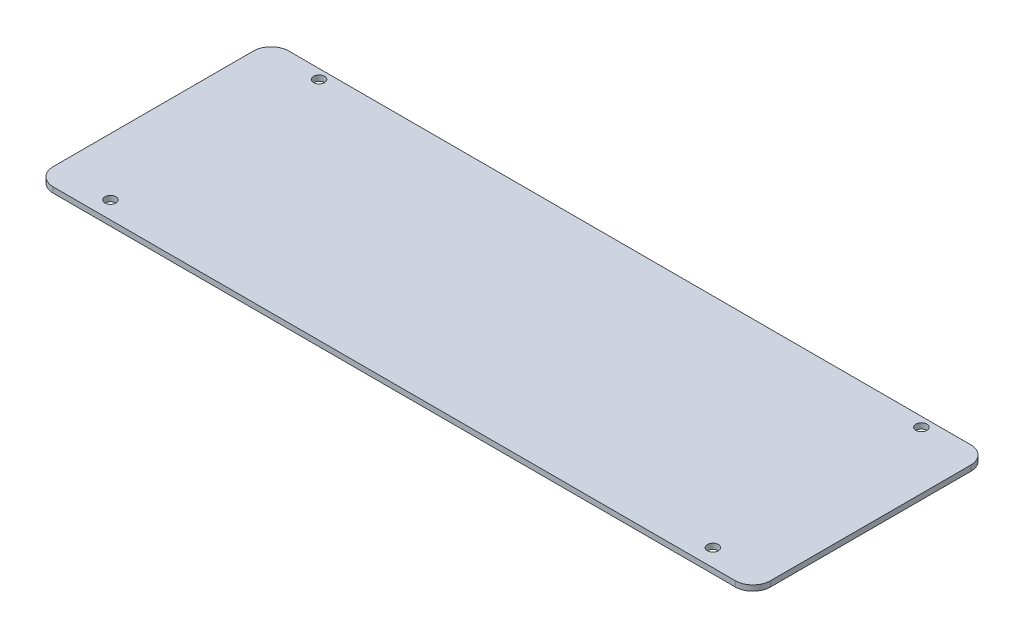
ISO-10303-21;
HEADER;
FILE_DESCRIPTION(('STEP AP214'),'2;1');
FILE_NAME('part.step','',(''),(''),'','','');
FILE_SCHEMA(('AUTOMOTIVE_DESIGN { 1 0 10303 214 1 1 1 1 }'));
ENDSEC;
DATA;
#1=APPLICATION_CONTEXT('core data for automotive mechanical design processes');
#2=APPLICATION_PROTOCOL_DEFINITION('international standard','automotive_design',2000,#1);
#3=PRODUCT_CONTEXT('',#1,'mechanical');
#4=PRODUCT('Part','Part','',(#3));
#5=PRODUCT_RELATED_PRODUCT_CATEGORY('part','',(#4));
#6=PRODUCT_DEFINITION_FORMATION('','',#4);
#7=PRODUCT_DEFINITION_CONTEXT('part definition',#1,'design');
#8=PRODUCT_DEFINITION('design','',#6,#7);
#9=PRODUCT_DEFINITION_SHAPE('','',#8);
#10=(LENGTH_UNIT() NAMED_UNIT(*) SI_UNIT(.MILLI.,.METRE.));
#11=(NAMED_UNIT(*) PLANE_ANGLE_UNIT() SI_UNIT($,.RADIAN.));
#12=(NAMED_UNIT(*) SI_UNIT($,.STERADIAN.) SOLID_ANGLE_UNIT());
#13=UNCERTAINTY_MEASURE_WITH_UNIT(LENGTH_MEASURE(1.E-05),#10,'distance_accuracy_value','');
#14=(GEOMETRIC_REPRESENTATION_CONTEXT(3) GLOBAL_UNCERTAINTY_ASSIGNED_CONTEXT((#13)) GLOBAL_UNIT_ASSIGNED_CONTEXT((#10,
#11,#12)) REPRESENTATION_CONTEXT('',''));
#15=CARTESIAN_POINT('',(0.,0.,0.));
#16=DIRECTION('',(0.,0.,1.));
#17=DIRECTION('',(1.,0.,0.));
#18=AXIS2_PLACEMENT_3D('',#15,#16,#17);
#19=CARTESIAN_POINT('',(0.,3.175,0.));
#20=DIRECTION('',(0.,-1.,0.));
#21=DIRECTION('',(0.,0.,-1.));
#22=AXIS2_PLACEMENT_3D('',#19,#20,#21);
#23=PLANE('',#22);
#24=DIRECTION('',(1.,0.,0.));
#25=VECTOR('',#24,1.);
#26=CARTESIAN_POINT('',(-205.196110364079,3.175,128.502458795408));
#27=LINE('',#26,#25);
#28=CARTESIAN_POINT('',(-195.036110364079,3.175,128.502458795408));
#29=VERTEX_POINT('',#28);
#30=CARTESIAN_POINT('',(199.28788965792,3.175,128.502458795408));
#31=VERTEX_POINT('',#30);
#32=EDGE_CURVE('E174',#29,#31,#27,.T.);
#33=ORIENTED_EDGE('',*,*,#32,.T.);
#34=CARTESIAN_POINT('',(199.28788965792,3.175,118.342458795408));
#35=DIRECTION('',(0.,-1.,0.));
#36=DIRECTION('',(0.,0.,-1.));
#37=AXIS2_PLACEMENT_3D('',#34,#35,#36);
#38=CIRCLE('',#37,10.16);
#39=CARTESIAN_POINT('',(209.44788965792,3.175,118.342458795408));
#40=VERTEX_POINT('',#39);
#41=EDGE_CURVE('E151',#31,#40,#38,.F.);
#42=ORIENTED_EDGE('',*,*,#41,.T.);
#43=DIRECTION('',(0.,0.,-1.));
#44=VECTOR('',#43,1.);
#45=CARTESIAN_POINT('',(209.44788965792,3.175,128.502458795408));
#46=LINE('',#45,#44);
#47=CARTESIAN_POINT('',(209.44788965792,3.175,2.55563577288898));
#48=VERTEX_POINT('',#47);
#49=EDGE_CURVE('E121',#40,#48,#46,.T.);
#50=ORIENTED_EDGE('',*,*,#49,.T.);
#51=CARTESIAN_POINT('',(199.28788965792,3.175,2.55563577288899));
#52=DIRECTION('',(0.,-1.,0.));
#53=DIRECTION('',(0.,0.,-1.));
#54=AXIS2_PLACEMENT_3D('',#51,#52,#53);
#55=CIRCLE('',#54,10.16);
#56=CARTESIAN_POINT('',(199.28788965792,3.175,-7.60436422711101));
#57=VERTEX_POINT('',#56);
#58=EDGE_CURVE('E58',#48,#57,#55,.F.);
#59=ORIENTED_EDGE('',*,*,#58,.T.);
#60=DIRECTION('',(-1.,0.,0.));
#61=VECTOR('',#60,1.);
#62=CARTESIAN_POINT('',(-205.196110364079,3.175,-7.60436422711101));
#63=LINE('',#62,#61);
#64=CARTESIAN_POINT('',(-195.036110364079,3.175,-7.60436422711101));
#65=VERTEX_POINT('',#64);
#66=EDGE_CURVE('E137',#57,#65,#63,.T.);
#67=ORIENTED_EDGE('',*,*,#66,.T.);
#68=CARTESIAN_POINT('',(-195.036110364079,3.175,2.55563577288898));
#69=DIRECTION('',(0.,-1.,0.));
#70=DIRECTION('',(0.,0.,-1.));
#71=AXIS2_PLACEMENT_3D('',#68,#69,#70);
#72=CIRCLE('',#71,10.16);
#73=CARTESIAN_POINT('',(-205.196110364079,3.175,2.55563577288898));
#74=VERTEX_POINT('',#73);
#75=EDGE_CURVE('E146',#65,#74,#72,.F.);
#76=ORIENTED_EDGE('',*,*,#75,.T.);
#77=DIRECTION('',(0.,0.,1.));
#78=VECTOR('',#77,1.);
#79=CARTESIAN_POINT('',(-205.196110364079,3.175,128.502458795408));
#80=LINE('',#79,#78);
#81=CARTESIAN_POINT('',(-205.196110364079,3.175,118.342458795408));
#82=VERTEX_POINT('',#81);
#83=EDGE_CURVE('E131',#74,#82,#80,.T.);
#84=ORIENTED_EDGE('',*,*,#83,.T.);
#85=CARTESIAN_POINT('',(-195.036110364079,3.175,118.342458795408));
#86=DIRECTION('',(0.,-1.,0.));
#87=DIRECTION('',(0.,0.,-1.));
#88=AXIS2_PLACEMENT_3D('',#85,#86,#87);
#89=CIRCLE('',#88,10.16);
#90=EDGE_CURVE('E148',#82,#29,#89,.F.);
#91=ORIENTED_EDGE('',*,*,#90,.T.);
#92=EDGE_LOOP('',(#33,#42,#50,#59,#67,#76,#84,#91));
#93=FACE_BOUND('',#92,.T.);
#94=CARTESIAN_POINT('',(-171.991110353079,3.175,-2.12847717143634));
#95=DIRECTION('',(0.,1.,0.));
#96=DIRECTION('',(0.,0.,1.));
#97=AXIS2_PLACEMENT_3D('',#94,#95,#96);
#98=CIRCLE('',#97,3.17499999999997);
#99=CARTESIAN_POINT('',(-171.991110353079,3.175,1.04652282856363));
#100=VERTEX_POINT('',#99);
#101=EDGE_CURVE('E167',#100,#100,#98,.T.);
#102=ORIENTED_EDGE('',*,*,#101,.F.);
#103=EDGE_LOOP('',(#102));
#104=FACE_BOUND('',#103,.T.);
#105=CARTESIAN_POINT('',(-171.991110353079,3.175,118.449728987914));
#106=DIRECTION('',(0.,1.,0.));
#107=DIRECTION('',(0.,0.,1.));
#108=AXIS2_PLACEMENT_3D('',#105,#106,#107);
#109=CIRCLE('',#108,3.17499999999997);
#110=CARTESIAN_POINT('',(-171.991110353079,3.175,121.624728987914));
#111=VERTEX_POINT('',#110);
#112=EDGE_CURVE('E179',#111,#111,#109,.T.);
#113=ORIENTED_EDGE('',*,*,#112,.F.);
#114=EDGE_LOOP('',(#113));
#115=FACE_BOUND('',#114,.T.);
#116=CARTESIAN_POINT('',(176.24288964692,3.175,-2.12847717143634));
#117=DIRECTION('',(0.,1.,0.));
#118=DIRECTION('',(0.,0.,-1.));
#119=AXIS2_PLACEMENT_3D('',#116,#117,#118);
#120=CIRCLE('',#119,3.17499999999997);
#121=CARTESIAN_POINT('',(176.24288964692,3.175,-5.30347717143631));
#122=VERTEX_POINT('',#121);
#123=EDGE_CURVE('E184',#122,#122,#120,.T.);
#124=ORIENTED_EDGE('',*,*,#123,.F.);
#125=EDGE_LOOP('',(#124));
#126=FACE_BOUND('',#125,.T.);
#127=CARTESIAN_POINT('',(176.24288964692,3.175,118.449728987914));
#128=DIRECTION('',(0.,1.,0.));
#129=DIRECTION('',(0.,0.,-1.));
#130=AXIS2_PLACEMENT_3D('',#127,#128,#129);
#131=CIRCLE('',#130,3.17499999999997);
#132=CARTESIAN_POINT('',(176.24288964692,3.175,115.274728987914));
#133=VERTEX_POINT('',#132);
#134=EDGE_CURVE('E190',#133,#133,#131,.T.);
#135=ORIENTED_EDGE('',*,*,#134,.F.);
#136=EDGE_LOOP('',(#135));
#137=FACE_BOUND('',#136,.T.);
#138=ADVANCED_FACE('F36',(#93,#104,#115,#126,#137),#23,.F.);
#139=CARTESIAN_POINT('',(0.,0.,0.));
#140=DIRECTION('',(0.,-1.,0.));
#141=DIRECTION('',(0.,0.,-1.));
#142=AXIS2_PLACEMENT_3D('',#139,#140,#141);
#143=PLANE('',#142);
#144=CARTESIAN_POINT('',(176.24288964692,0.,-2.12847717143634));
#145=DIRECTION('',(0.,1.,0.));
#146=DIRECTION('',(0.,0.,-1.));
#147=AXIS2_PLACEMENT_3D('',#144,#145,#146);
#148=CIRCLE('',#147,3.17499999999997);
#149=CARTESIAN_POINT('',(176.24288964692,0.,-5.30347717143631));
#150=VERTEX_POINT('',#149);
#151=EDGE_CURVE('E187',#150,#150,#148,.T.);
#152=ORIENTED_EDGE('',*,*,#151,.T.);
#153=EDGE_LOOP('',(#152));
#154=FACE_BOUND('',#153,.T.);
#155=CARTESIAN_POINT('',(-171.991110353079,0.,-2.12847717143634));
#156=DIRECTION('',(0.,1.,0.));
#157=DIRECTION('',(0.,0.,1.));
#158=AXIS2_PLACEMENT_3D('',#155,#156,#157);
#159=CIRCLE('',#158,3.17499999999997);
#160=CARTESIAN_POINT('',(-171.991110353079,0.,1.04652282856363));
#161=VERTEX_POINT('',#160);
#162=EDGE_CURVE('E169',#161,#161,#159,.T.);
#163=ORIENTED_EDGE('',*,*,#162,.T.);
#164=EDGE_LOOP('',(#163));
#165=FACE_BOUND('',#164,.T.);
#166=DIRECTION('',(0.,0.,-1.));
#167=VECTOR('',#166,1.);
#168=CARTESIAN_POINT('',(209.44788965792,0.,128.502458795408));
#169=LINE('',#168,#167);
#170=CARTESIAN_POINT('',(209.44788965792,0.,118.342458795408));
#171=VERTEX_POINT('',#170);
#172=CARTESIAN_POINT('',(209.44788965792,0.,2.55563577288898));
#173=VERTEX_POINT('',#172);
#174=EDGE_CURVE('E119',#171,#173,#169,.T.);
#175=ORIENTED_EDGE('',*,*,#174,.F.);
#176=CARTESIAN_POINT('',(199.28788965792,0.,118.342458795408));
#177=DIRECTION('',(0.,-1.,0.));
#178=DIRECTION('',(0.,0.,-1.));
#179=AXIS2_PLACEMENT_3D('',#176,#177,#178);
#180=CIRCLE('',#179,10.16);
#181=CARTESIAN_POINT('',(199.28788965792,0.,128.502458795408));
#182=VERTEX_POINT('',#181);
#183=EDGE_CURVE('E102',#171,#182,#180,.T.);
#184=ORIENTED_EDGE('',*,*,#183,.T.);
#185=DIRECTION('',(1.,0.,0.));
#186=VECTOR('',#185,1.);
#187=CARTESIAN_POINT('',(-205.196110364079,0.,128.502458795408));
#188=LINE('',#187,#186);
#189=CARTESIAN_POINT('',(-195.036110364079,0.,128.502458795408));
#190=VERTEX_POINT('',#189);
#191=EDGE_CURVE('E129',#190,#182,#188,.T.);
#192=ORIENTED_EDGE('',*,*,#191,.F.);
#193=CARTESIAN_POINT('',(-195.036110364079,0.,118.342458795408));
#194=DIRECTION('',(0.,-1.,0.));
#195=DIRECTION('',(0.,0.,-1.));
#196=AXIS2_PLACEMENT_3D('',#193,#194,#195);
#197=CIRCLE('',#196,10.16);
#198=CARTESIAN_POINT('',(-205.196110364079,0.,118.342458795408));
#199=VERTEX_POINT('',#198);
#200=EDGE_CURVE('E140',#190,#199,#197,.T.);
#201=ORIENTED_EDGE('',*,*,#200,.T.);
#202=DIRECTION('',(0.,0.,1.));
#203=VECTOR('',#202,1.);
#204=CARTESIAN_POINT('',(-205.196110364079,0.,128.502458795408));
#205=LINE('',#204,#203);
#206=CARTESIAN_POINT('',(-205.196110364079,0.,2.55563577288898));
#207=VERTEX_POINT('',#206);
#208=EDGE_CURVE('E133',#207,#199,#205,.T.);
#209=ORIENTED_EDGE('',*,*,#208,.F.);
#210=CARTESIAN_POINT('',(-195.036110364079,0.,2.55563577288898));
#211=DIRECTION('',(0.,-1.,0.));
#212=DIRECTION('',(0.,0.,-1.));
#213=AXIS2_PLACEMENT_3D('',#210,#211,#212);
#214=CIRCLE('',#213,10.16);
#215=CARTESIAN_POINT('',(-195.036110364079,0.,-7.60436422711101));
#216=VERTEX_POINT('',#215);
#217=EDGE_CURVE('E122',#207,#216,#214,.T.);
#218=ORIENTED_EDGE('',*,*,#217,.T.);
#219=DIRECTION('',(-1.,0.,0.));
#220=VECTOR('',#219,1.);
#221=CARTESIAN_POINT('',(-205.196110364079,0.,-7.60436422711101));
#222=LINE('',#221,#220);
#223=CARTESIAN_POINT('',(199.28788965792,0.,-7.60436422711101));
#224=VERTEX_POINT('',#223);
#225=EDGE_CURVE('E128',#224,#216,#222,.T.);
#226=ORIENTED_EDGE('',*,*,#225,.F.);
#227=CARTESIAN_POINT('',(199.28788965792,0.,2.55563577288899));
#228=DIRECTION('',(0.,-1.,0.));
#229=DIRECTION('',(0.,0.,-1.));
#230=AXIS2_PLACEMENT_3D('',#227,#228,#229);
#231=CIRCLE('',#230,10.16);
#232=EDGE_CURVE('E113',#224,#173,#231,.T.);
#233=ORIENTED_EDGE('',*,*,#232,.T.);
#234=EDGE_LOOP('',(#175,#184,#192,#201,#209,#218,#226,#233));
#235=FACE_BOUND('',#234,.T.);
#236=CARTESIAN_POINT('',(-171.991110353079,0.,118.449728987914));
#237=DIRECTION('',(0.,1.,0.));
#238=DIRECTION('',(0.,0.,1.));
#239=AXIS2_PLACEMENT_3D('',#236,#237,#238);
#240=CIRCLE('',#239,3.17499999999997);
#241=CARTESIAN_POINT('',(-171.991110353079,0.,121.624728987914));
#242=VERTEX_POINT('',#241);
#243=EDGE_CURVE('E181',#242,#242,#240,.T.);
#244=ORIENTED_EDGE('',*,*,#243,.T.);
#245=EDGE_LOOP('',(#244));
#246=FACE_BOUND('',#245,.T.);
#247=CARTESIAN_POINT('',(176.24288964692,0.,118.449728987914));
#248=DIRECTION('',(0.,1.,0.));
#249=DIRECTION('',(0.,0.,-1.));
#250=AXIS2_PLACEMENT_3D('',#247,#248,#249);
#251=CIRCLE('',#250,3.17499999999997);
#252=CARTESIAN_POINT('',(176.24288964692,0.,115.274728987914));
#253=VERTEX_POINT('',#252);
#254=EDGE_CURVE('E193',#253,#253,#251,.T.);
#255=ORIENTED_EDGE('',*,*,#254,.T.);
#256=EDGE_LOOP('',(#255));
#257=FACE_BOUND('',#256,.T.);
#258=ADVANCED_FACE('F125',(#154,#165,#235,#246,#257),#143,.T.);
#259=CARTESIAN_POINT('',(-205.196110364079,3.175,128.502458795408));
#260=DIRECTION('',(1.,0.,0.));
#261=DIRECTION('',(0.,0.,-1.));
#262=AXIS2_PLACEMENT_3D('',#259,#260,#261);
#263=PLANE('',#262);
#264=ORIENTED_EDGE('',*,*,#208,.T.);
#265=DIRECTION('',(0.,-1.,0.));
#266=VECTOR('',#265,1.);
#267=CARTESIAN_POINT('',(-205.196110364079,3.175,118.342458795408));
#268=LINE('',#267,#266);
#269=EDGE_CURVE('E11',#199,#82,#268,.F.);
#270=ORIENTED_EDGE('',*,*,#269,.T.);
#271=ORIENTED_EDGE('',*,*,#83,.F.);
#272=DIRECTION('',(0.,-1.,0.));
#273=VECTOR('',#272,1.);
#274=CARTESIAN_POINT('',(-205.196110364079,3.175,2.55563577288898));
#275=LINE('',#274,#273);
#276=EDGE_CURVE('E44',#74,#207,#275,.T.);
#277=ORIENTED_EDGE('',*,*,#276,.T.);
#278=EDGE_LOOP('',(#264,#270,#271,#277));
#279=FACE_BOUND('',#278,.T.);
#280=ADVANCED_FACE('F162',(#279),#263,.F.);
#281=CARTESIAN_POINT('',(-205.196110364079,3.175,128.502458795408));
#282=DIRECTION('',(0.,0.,-1.));
#283=DIRECTION('',(-1.,0.,0.));
#284=AXIS2_PLACEMENT_3D('',#281,#282,#283);
#285=PLANE('',#284);
#286=ORIENTED_EDGE('',*,*,#191,.T.);
#287=DIRECTION('',(0.,-1.,0.));
#288=VECTOR('',#287,1.);
#289=CARTESIAN_POINT('',(199.28788965792,3.175,128.502458795408));
#290=LINE('',#289,#288);
#291=EDGE_CURVE('E107',#182,#31,#290,.F.);
#292=ORIENTED_EDGE('',*,*,#291,.T.);
#293=ORIENTED_EDGE('',*,*,#32,.F.);
#294=DIRECTION('',(0.,-1.,0.));
#295=VECTOR('',#294,1.);
#296=CARTESIAN_POINT('',(-195.036110364079,3.175,128.502458795408));
#297=LINE('',#296,#295);
#298=EDGE_CURVE('E112',#29,#190,#297,.T.);
#299=ORIENTED_EDGE('',*,*,#298,.T.);
#300=EDGE_LOOP('',(#286,#292,#293,#299));
#301=FACE_BOUND('',#300,.T.);
#302=ADVANCED_FACE('F219',(#301),#285,.F.);
#303=CARTESIAN_POINT('',(209.44788965792,3.175,128.502458795408));
#304=DIRECTION('',(-1.,0.,0.));
#305=DIRECTION('',(0.,0.,1.));
#306=AXIS2_PLACEMENT_3D('',#303,#304,#305);
#307=PLANE('',#306);
#308=ORIENTED_EDGE('',*,*,#49,.F.);
#309=DIRECTION('',(0.,-1.,0.));
#310=VECTOR('',#309,1.);
#311=CARTESIAN_POINT('',(209.44788965792,3.175,118.342458795408));
#312=LINE('',#311,#310);
#313=EDGE_CURVE('E106',#40,#171,#312,.T.);
#314=ORIENTED_EDGE('',*,*,#313,.T.);
#315=ORIENTED_EDGE('',*,*,#174,.T.);
#316=DIRECTION('',(0.,-1.,0.));
#317=VECTOR('',#316,1.);
#318=CARTESIAN_POINT('',(209.44788965792,3.175,2.55563577288898));
#319=LINE('',#318,#317);
#320=EDGE_CURVE('E123',#173,#48,#319,.F.);
#321=ORIENTED_EDGE('',*,*,#320,.T.);
#322=EDGE_LOOP('',(#308,#314,#315,#321));
#323=FACE_BOUND('',#322,.T.);
#324=ADVANCED_FACE('F118',(#323),#307,.F.);
#325=CARTESIAN_POINT('',(-205.196110364079,3.175,-7.60436422711101));
#326=DIRECTION('',(0.,0.,1.));
#327=DIRECTION('',(1.,0.,0.));
#328=AXIS2_PLACEMENT_3D('',#325,#326,#327);
#329=PLANE('',#328);
#330=ORIENTED_EDGE('',*,*,#66,.F.);
#331=DIRECTION('',(0.,-1.,0.));
#332=VECTOR('',#331,1.);
#333=CARTESIAN_POINT('',(199.28788965792,3.175,-7.60436422711101));
#334=LINE('',#333,#332);
#335=EDGE_CURVE('E154',#57,#224,#334,.T.);
#336=ORIENTED_EDGE('',*,*,#335,.T.);
#337=ORIENTED_EDGE('',*,*,#225,.T.);
#338=DIRECTION('',(0.,-1.,0.));
#339=VECTOR('',#338,1.);
#340=CARTESIAN_POINT('',(-195.036110364079,3.175,-7.60436422711101));
#341=LINE('',#340,#339);
#342=EDGE_CURVE('E51',#216,#65,#341,.F.);
#343=ORIENTED_EDGE('',*,*,#342,.T.);
#344=EDGE_LOOP('',(#330,#336,#337,#343));
#345=FACE_BOUND('',#344,.T.);
#346=ADVANCED_FACE('F214',(#345),#329,.F.);
#347=CARTESIAN_POINT('',(-171.991110353079,3.175,-2.12847717143634));
#348=DIRECTION('',(0.,-1.,0.));
#349=DIRECTION('',(0.,0.,-1.));
#350=AXIS2_PLACEMENT_3D('',#347,#348,#349);
#351=CYLINDRICAL_SURFACE('',#350,3.17499999999997);
#352=ORIENTED_EDGE('',*,*,#101,.T.);
#353=EDGE_LOOP('',(#352));
#354=FACE_BOUND('',#353,.T.);
#355=ORIENTED_EDGE('',*,*,#162,.F.);
#356=EDGE_LOOP('',(#355));
#357=FACE_BOUND('',#356,.T.);
#358=ADVANCED_FACE('F211',(#354,#357),#351,.F.);
#359=CARTESIAN_POINT('',(-171.991110353079,3.175,118.449728987914));
#360=DIRECTION('',(0.,-1.,0.));
#361=DIRECTION('',(0.,0.,-1.));
#362=AXIS2_PLACEMENT_3D('',#359,#360,#361);
#363=CYLINDRICAL_SURFACE('',#362,3.17499999999997);
#364=ORIENTED_EDGE('',*,*,#112,.T.);
#365=EDGE_LOOP('',(#364));
#366=FACE_BOUND('',#365,.T.);
#367=ORIENTED_EDGE('',*,*,#243,.F.);
#368=EDGE_LOOP('',(#367));
#369=FACE_BOUND('',#368,.T.);
#370=ADVANCED_FACE('F312',(#366,#369),#363,.F.);
#371=CARTESIAN_POINT('',(176.24288964692,3.175,-2.12847717143634));
#372=DIRECTION('',(0.,-1.,0.));
#373=DIRECTION('',(0.,0.,-1.));
#374=AXIS2_PLACEMENT_3D('',#371,#372,#373);
#375=CYLINDRICAL_SURFACE('',#374,3.17499999999997);
#376=ORIENTED_EDGE('',*,*,#123,.T.);
#377=EDGE_LOOP('',(#376));
#378=FACE_BOUND('',#377,.T.);
#379=ORIENTED_EDGE('',*,*,#151,.F.);
#380=EDGE_LOOP('',(#379));
#381=FACE_BOUND('',#380,.T.);
#382=ADVANCED_FACE('F303',(#378,#381),#375,.F.);
#383=CARTESIAN_POINT('',(176.24288964692,3.175,118.449728987914));
#384=DIRECTION('',(0.,-1.,0.));
#385=DIRECTION('',(0.,0.,-1.));
#386=AXIS2_PLACEMENT_3D('',#383,#384,#385);
#387=CYLINDRICAL_SURFACE('',#386,3.17499999999997);
#388=ORIENTED_EDGE('',*,*,#134,.T.);
#389=EDGE_LOOP('',(#388));
#390=FACE_BOUND('',#389,.T.);
#391=ORIENTED_EDGE('',*,*,#254,.F.);
#392=EDGE_LOOP('',(#391));
#393=FACE_BOUND('',#392,.T.);
#394=ADVANCED_FACE('F199',(#390,#393),#387,.F.);
#395=CARTESIAN_POINT('',(199.28788965792,3.175,118.342458795408));
#396=DIRECTION('',(0.,-1.,0.));
#397=DIRECTION('',(0.,0.,-1.));
#398=AXIS2_PLACEMENT_3D('',#395,#396,#397);
#399=CYLINDRICAL_SURFACE('',#398,10.16);
#400=ORIENTED_EDGE('',*,*,#41,.F.);
#401=ORIENTED_EDGE('',*,*,#291,.F.);
#402=ORIENTED_EDGE('',*,*,#183,.F.);
#403=ORIENTED_EDGE('',*,*,#313,.F.);
#404=EDGE_LOOP('',(#400,#401,#402,#403));
#405=FACE_BOUND('',#404,.T.);
#406=ADVANCED_FACE('F105',(#405),#399,.T.);
#407=CARTESIAN_POINT('',(199.28788965792,3.175,2.55563577288899));
#408=DIRECTION('',(0.,-1.,0.));
#409=DIRECTION('',(0.,0.,-1.));
#410=AXIS2_PLACEMENT_3D('',#407,#408,#409);
#411=CYLINDRICAL_SURFACE('',#410,10.16);
#412=ORIENTED_EDGE('',*,*,#58,.F.);
#413=ORIENTED_EDGE('',*,*,#320,.F.);
#414=ORIENTED_EDGE('',*,*,#232,.F.);
#415=ORIENTED_EDGE('',*,*,#335,.F.);
#416=EDGE_LOOP('',(#412,#413,#414,#415));
#417=FACE_BOUND('',#416,.T.);
#418=ADVANCED_FACE('F227',(#417),#411,.T.);
#419=CARTESIAN_POINT('',(-195.036110364079,3.175,118.342458795408));
#420=DIRECTION('',(0.,-1.,0.));
#421=DIRECTION('',(0.,0.,-1.));
#422=AXIS2_PLACEMENT_3D('',#419,#420,#421);
#423=CYLINDRICAL_SURFACE('',#422,10.16);
#424=ORIENTED_EDGE('',*,*,#90,.F.);
#425=ORIENTED_EDGE('',*,*,#269,.F.);
#426=ORIENTED_EDGE('',*,*,#200,.F.);
#427=ORIENTED_EDGE('',*,*,#298,.F.);
#428=EDGE_LOOP('',(#424,#425,#426,#427));
#429=FACE_BOUND('',#428,.T.);
#430=ADVANCED_FACE('F229',(#429),#423,.T.);
#431=CARTESIAN_POINT('',(-195.036110364079,3.175,2.55563577288898));
#432=DIRECTION('',(0.,-1.,0.));
#433=DIRECTION('',(0.,0.,-1.));
#434=AXIS2_PLACEMENT_3D('',#431,#432,#433);
#435=CYLINDRICAL_SURFACE('',#434,10.16);
#436=ORIENTED_EDGE('',*,*,#75,.F.);
#437=ORIENTED_EDGE('',*,*,#342,.F.);
#438=ORIENTED_EDGE('',*,*,#217,.F.);
#439=ORIENTED_EDGE('',*,*,#276,.F.);
#440=EDGE_LOOP('',(#436,#437,#438,#439));
#441=FACE_BOUND('',#440,.T.);
#442=ADVANCED_FACE('F38',(#441),#435,.T.);
#443=CLOSED_SHELL('',(#138,#258,#280,#302,#324,#346,#358,#370,#382,#394,#406,#418,#430,#442));
#444=MANIFOLD_SOLID_BREP('B2',#443);
#445=ADVANCED_BREP_SHAPE_REPRESENTATION('',(#18,#444),#14);
#446=SHAPE_DEFINITION_REPRESENTATION(#9,#445);
ENDSEC;
END-ISO-10303-21;
